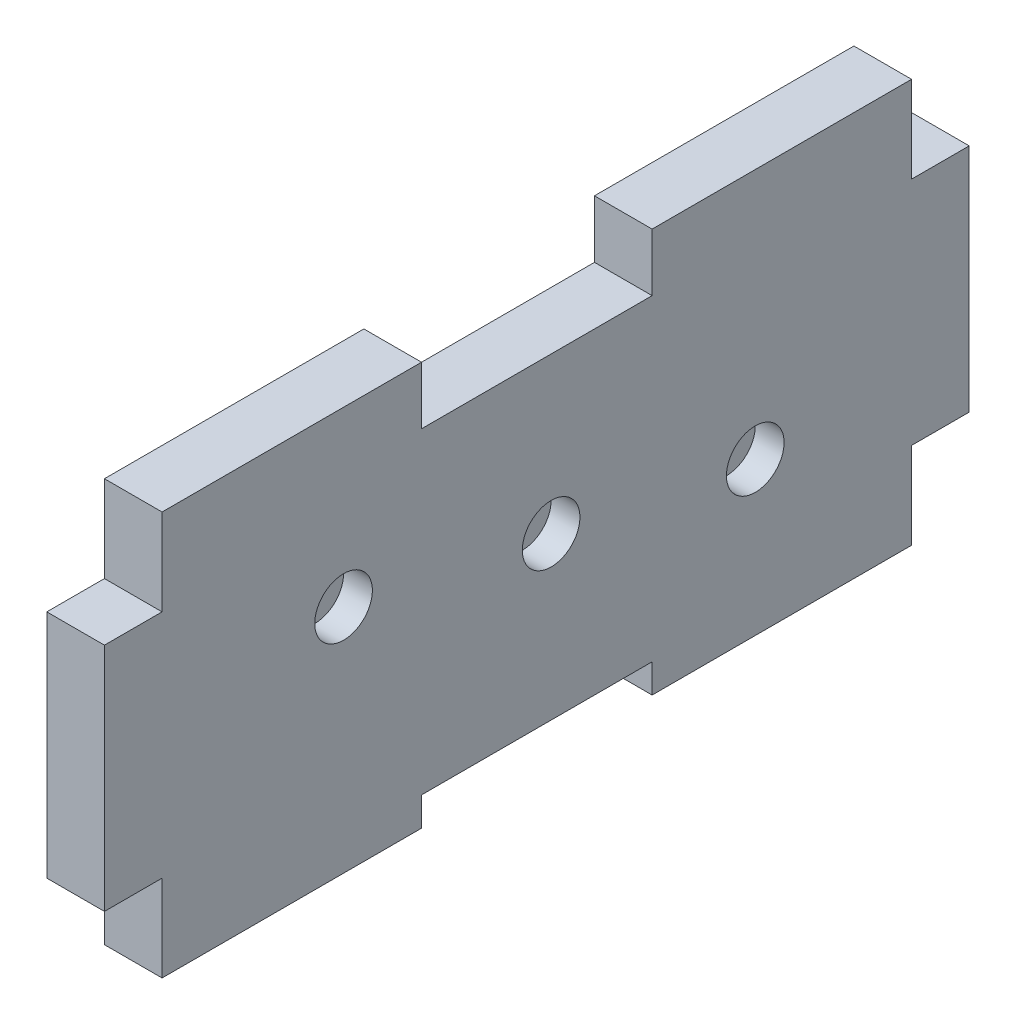
ISO-10303-21;
HEADER;
FILE_DESCRIPTION(('STEP AP214'),'2;1');
FILE_NAME('part.step','',(''),(''),'','','');
FILE_SCHEMA(('AUTOMOTIVE_DESIGN { 1 0 10303 214 1 1 1 1 }'));
ENDSEC;
DATA;
#1=APPLICATION_CONTEXT('core data for automotive mechanical design processes');
#2=APPLICATION_PROTOCOL_DEFINITION('international standard','automotive_design',2000,#1);
#3=PRODUCT_CONTEXT('',#1,'mechanical');
#4=PRODUCT('Part','Part','',(#3));
#5=PRODUCT_RELATED_PRODUCT_CATEGORY('part','',(#4));
#6=PRODUCT_DEFINITION_FORMATION('','',#4);
#7=PRODUCT_DEFINITION_CONTEXT('part definition',#1,'design');
#8=PRODUCT_DEFINITION('design','',#6,#7);
#9=PRODUCT_DEFINITION_SHAPE('','',#8);
#10=(LENGTH_UNIT() NAMED_UNIT(*) SI_UNIT(.MILLI.,.METRE.));
#11=(NAMED_UNIT(*) PLANE_ANGLE_UNIT() SI_UNIT($,.RADIAN.));
#12=(NAMED_UNIT(*) SI_UNIT($,.STERADIAN.) SOLID_ANGLE_UNIT());
#13=UNCERTAINTY_MEASURE_WITH_UNIT(LENGTH_MEASURE(1.E-05),#10,'distance_accuracy_value','');
#14=(GEOMETRIC_REPRESENTATION_CONTEXT(3) GLOBAL_UNCERTAINTY_ASSIGNED_CONTEXT((#13)) GLOBAL_UNIT_ASSIGNED_CONTEXT((#10,
#11,#12)) REPRESENTATION_CONTEXT('',''));
#15=CARTESIAN_POINT('',(0.,0.,0.));
#16=DIRECTION('',(0.,0.,1.));
#17=DIRECTION('',(1.,0.,0.));
#18=AXIS2_PLACEMENT_3D('',#15,#16,#17);
#19=CARTESIAN_POINT('',(5.,0.,55.));
#20=DIRECTION('',(0.,0.,1.));
#21=DIRECTION('',(1.,0.,0.));
#22=AXIS2_PLACEMENT_3D('',#19,#20,#21);
#23=PLANE('',#22);
#24=DIRECTION('',(-1.,0.,0.));
#25=VECTOR('',#24,1.);
#26=CARTESIAN_POINT('',(5.,5.00000000000001,55.));
#27=LINE('',#26,#25);
#28=CARTESIAN_POINT('',(5.,5.00000000000001,55.));
#29=VERTEX_POINT('',#28);
#30=CARTESIAN_POINT('',(-5.,5.00000000000001,55.));
#31=VERTEX_POINT('',#30);
#32=EDGE_CURVE('E180',#29,#31,#27,.T.);
#33=ORIENTED_EDGE('',*,*,#32,.T.);
#34=DIRECTION('',(0.,1.,0.));
#35=VECTOR('',#34,1.);
#36=CARTESIAN_POINT('',(-5.,0.,55.));
#37=LINE('',#36,#35);
#38=CARTESIAN_POINT('',(-5.,0.,55.));
#39=VERTEX_POINT('',#38);
#40=EDGE_CURVE('E179',#39,#31,#37,.T.);
#41=ORIENTED_EDGE('',*,*,#40,.F.);
#42=DIRECTION('',(-1.,0.,0.));
#43=VECTOR('',#42,1.);
#44=CARTESIAN_POINT('',(5.,0.,55.));
#45=LINE('',#44,#43);
#46=CARTESIAN_POINT('',(5.,0.,55.));
#47=VERTEX_POINT('',#46);
#48=EDGE_CURVE('E11',#47,#39,#45,.T.);
#49=ORIENTED_EDGE('',*,*,#48,.F.);
#50=DIRECTION('',(0.,1.,0.));
#51=VECTOR('',#50,1.);
#52=CARTESIAN_POINT('',(5.,0.,55.));
#53=LINE('',#52,#51);
#54=EDGE_CURVE('E254',#47,#29,#53,.T.);
#55=ORIENTED_EDGE('',*,*,#54,.T.);
#56=EDGE_LOOP('',(#33,#41,#49,#55));
#57=FACE_BOUND('',#56,.T.);
#58=ADVANCED_FACE('F35',(#57),#23,.T.);
#59=CARTESIAN_POINT('',(5.,0.,0.));
#60=DIRECTION('',(0.,1.,0.));
#61=DIRECTION('',(0.,0.,1.));
#62=AXIS2_PLACEMENT_3D('',#59,#60,#61);
#63=PLANE('',#62);
#64=ORIENTED_EDGE('',*,*,#48,.T.);
#65=DIRECTION('',(0.,0.,1.));
#66=VECTOR('',#65,1.);
#67=CARTESIAN_POINT('',(-5.,0.,10.));
#68=LINE('',#67,#66);
#69=CARTESIAN_POINT('',(-5.,0.,10.));
#70=VERTEX_POINT('',#69);
#71=EDGE_CURVE('E174',#70,#39,#68,.T.);
#72=ORIENTED_EDGE('',*,*,#71,.F.);
#73=DIRECTION('',(-1.,0.,0.));
#74=VECTOR('',#73,1.);
#75=CARTESIAN_POINT('',(5.,0.,10.));
#76=LINE('',#75,#74);
#77=CARTESIAN_POINT('',(5.,0.,10.));
#78=VERTEX_POINT('',#77);
#79=EDGE_CURVE('E42',#78,#70,#76,.T.);
#80=ORIENTED_EDGE('',*,*,#79,.F.);
#81=DIRECTION('',(0.,0.,-1.));
#82=VECTOR('',#81,1.);
#83=CARTESIAN_POINT('',(5.,0.,0.));
#84=LINE('',#83,#82);
#85=EDGE_CURVE('E175',#47,#78,#84,.T.);
#86=ORIENTED_EDGE('',*,*,#85,.F.);
#87=EDGE_LOOP('',(#64,#72,#80,#86));
#88=FACE_BOUND('',#87,.T.);
#89=ADVANCED_FACE('F171',(#88),#63,.F.);
#90=CARTESIAN_POINT('',(5.,0.,10.));
#91=DIRECTION('',(0.,0.,1.));
#92=DIRECTION('',(1.,0.,0.));
#93=AXIS2_PLACEMENT_3D('',#90,#91,#92);
#94=PLANE('',#93);
#95=ORIENTED_EDGE('',*,*,#79,.T.);
#96=DIRECTION('',(0.,-1.,0.));
#97=VECTOR('',#96,1.);
#98=CARTESIAN_POINT('',(-5.,15.,10.));
#99=LINE('',#98,#97);
#100=CARTESIAN_POINT('',(-5.,15.,10.));
#101=VERTEX_POINT('',#100);
#102=EDGE_CURVE('E190',#101,#70,#99,.T.);
#103=ORIENTED_EDGE('',*,*,#102,.F.);
#104=DIRECTION('',(-1.,0.,0.));
#105=VECTOR('',#104,1.);
#106=CARTESIAN_POINT('',(5.,15.,10.));
#107=LINE('',#106,#105);
#108=CARTESIAN_POINT('',(5.,15.,10.));
#109=VERTEX_POINT('',#108);
#110=EDGE_CURVE('E336',#109,#101,#107,.T.);
#111=ORIENTED_EDGE('',*,*,#110,.F.);
#112=DIRECTION('',(0.,1.,0.));
#113=VECTOR('',#112,1.);
#114=CARTESIAN_POINT('',(5.,0.,10.));
#115=LINE('',#114,#113);
#116=EDGE_CURVE('E263',#78,#109,#115,.T.);
#117=ORIENTED_EDGE('',*,*,#116,.F.);
#118=EDGE_LOOP('',(#95,#103,#111,#117));
#119=FACE_BOUND('',#118,.T.);
#120=ADVANCED_FACE('F339',(#119),#94,.F.);
#121=CARTESIAN_POINT('',(5.,15.,0.));
#122=DIRECTION('',(0.,-1.,0.));
#123=DIRECTION('',(0.,0.,-1.));
#124=AXIS2_PLACEMENT_3D('',#121,#122,#123);
#125=PLANE('',#124);
#126=ORIENTED_EDGE('',*,*,#110,.T.);
#127=DIRECTION('',(0.,0.,1.));
#128=VECTOR('',#127,1.);
#129=CARTESIAN_POINT('',(-5.,15.,0.));
#130=LINE('',#129,#128);
#131=CARTESIAN_POINT('',(-5.,15.,0.));
#132=VERTEX_POINT('',#131);
#133=EDGE_CURVE('E239',#132,#101,#130,.T.);
#134=ORIENTED_EDGE('',*,*,#133,.F.);
#135=DIRECTION('',(-1.,0.,0.));
#136=VECTOR('',#135,1.);
#137=CARTESIAN_POINT('',(5.,15.,0.));
#138=LINE('',#137,#136);
#139=CARTESIAN_POINT('',(5.,15.,0.));
#140=VERTEX_POINT('',#139);
#141=EDGE_CURVE('E334',#140,#132,#138,.T.);
#142=ORIENTED_EDGE('',*,*,#141,.F.);
#143=DIRECTION('',(0.,0.,1.));
#144=VECTOR('',#143,1.);
#145=CARTESIAN_POINT('',(5.,15.,0.));
#146=LINE('',#145,#144);
#147=EDGE_CURVE('E266',#140,#109,#146,.T.);
#148=ORIENTED_EDGE('',*,*,#147,.T.);
#149=EDGE_LOOP('',(#126,#134,#142,#148));
#150=FACE_BOUND('',#149,.T.);
#151=ADVANCED_FACE('F427',(#150),#125,.T.);
#152=CARTESIAN_POINT('',(5.,0.,0.));
#153=DIRECTION('',(0.,0.,-1.));
#154=DIRECTION('',(0.,1.,0.));
#155=AXIS2_PLACEMENT_3D('',#152,#153,#154);
#156=PLANE('',#155);
#157=ORIENTED_EDGE('',*,*,#141,.T.);
#158=DIRECTION('',(0.,-1.,0.));
#159=VECTOR('',#158,1.);
#160=CARTESIAN_POINT('',(-5.,55.,0.));
#161=LINE('',#160,#159);
#162=CARTESIAN_POINT('',(-5.,55.,0.));
#163=VERTEX_POINT('',#162);
#164=EDGE_CURVE('E236',#163,#132,#161,.T.);
#165=ORIENTED_EDGE('',*,*,#164,.F.);
#166=DIRECTION('',(-1.,0.,0.));
#167=VECTOR('',#166,1.);
#168=CARTESIAN_POINT('',(5.,55.,0.));
#169=LINE('',#168,#167);
#170=CARTESIAN_POINT('',(5.,55.,0.));
#171=VERTEX_POINT('',#170);
#172=EDGE_CURVE('E332',#171,#163,#169,.T.);
#173=ORIENTED_EDGE('',*,*,#172,.F.);
#174=DIRECTION('',(0.,-1.,0.));
#175=VECTOR('',#174,1.);
#176=CARTESIAN_POINT('',(5.,0.,0.));
#177=LINE('',#176,#175);
#178=EDGE_CURVE('E269',#171,#140,#177,.T.);
#179=ORIENTED_EDGE('',*,*,#178,.T.);
#180=EDGE_LOOP('',(#157,#165,#173,#179));
#181=FACE_BOUND('',#180,.T.);
#182=ADVANCED_FACE('F346',(#181),#156,.T.);
#183=CARTESIAN_POINT('',(5.,55.,0.));
#184=DIRECTION('',(0.,-1.,0.));
#185=DIRECTION('',(0.,0.,-1.));
#186=AXIS2_PLACEMENT_3D('',#183,#184,#185);
#187=PLANE('',#186);
#188=ORIENTED_EDGE('',*,*,#172,.T.);
#189=DIRECTION('',(0.,0.,-1.));
#190=VECTOR('',#189,1.);
#191=CARTESIAN_POINT('',(-5.,55.,10.));
#192=LINE('',#191,#190);
#193=CARTESIAN_POINT('',(-5.,55.,10.));
#194=VERTEX_POINT('',#193);
#195=EDGE_CURVE('E233',#194,#163,#192,.T.);
#196=ORIENTED_EDGE('',*,*,#195,.F.);
#197=DIRECTION('',(-1.,0.,0.));
#198=VECTOR('',#197,1.);
#199=CARTESIAN_POINT('',(5.,55.,10.));
#200=LINE('',#199,#198);
#201=CARTESIAN_POINT('',(5.,55.,10.));
#202=VERTEX_POINT('',#201);
#203=EDGE_CURVE('E330',#202,#194,#200,.T.);
#204=ORIENTED_EDGE('',*,*,#203,.F.);
#205=DIRECTION('',(0.,0.,1.));
#206=VECTOR('',#205,1.);
#207=CARTESIAN_POINT('',(5.,55.,0.));
#208=LINE('',#207,#206);
#209=EDGE_CURVE('E272',#171,#202,#208,.T.);
#210=ORIENTED_EDGE('',*,*,#209,.F.);
#211=EDGE_LOOP('',(#188,#196,#204,#210));
#212=FACE_BOUND('',#211,.T.);
#213=ADVANCED_FACE('F352',(#212),#187,.F.);
#214=CARTESIAN_POINT('',(5.,0.,9.99999999999999));
#215=DIRECTION('',(0.,0.,-1.));
#216=DIRECTION('',(0.,1.,0.));
#217=AXIS2_PLACEMENT_3D('',#214,#215,#216);
#218=PLANE('',#217);
#219=ORIENTED_EDGE('',*,*,#203,.T.);
#220=DIRECTION('',(0.,-1.,0.));
#221=VECTOR('',#220,1.);
#222=CARTESIAN_POINT('',(-5.,70.,10.));
#223=LINE('',#222,#221);
#224=CARTESIAN_POINT('',(-5.,70.,10.));
#225=VERTEX_POINT('',#224);
#226=EDGE_CURVE('E230',#225,#194,#223,.T.);
#227=ORIENTED_EDGE('',*,*,#226,.F.);
#228=DIRECTION('',(-1.,0.,0.));
#229=VECTOR('',#228,1.);
#230=CARTESIAN_POINT('',(5.,70.,10.));
#231=LINE('',#230,#229);
#232=CARTESIAN_POINT('',(5.,70.,10.));
#233=VERTEX_POINT('',#232);
#234=EDGE_CURVE('E328',#233,#225,#231,.T.);
#235=ORIENTED_EDGE('',*,*,#234,.F.);
#236=DIRECTION('',(0.,-1.,0.));
#237=VECTOR('',#236,1.);
#238=CARTESIAN_POINT('',(5.,0.,9.99999999999999));
#239=LINE('',#238,#237);
#240=EDGE_CURVE('E274',#233,#202,#239,.T.);
#241=ORIENTED_EDGE('',*,*,#240,.T.);
#242=EDGE_LOOP('',(#219,#227,#235,#241));
#243=FACE_BOUND('',#242,.T.);
#244=ADVANCED_FACE('F453',(#243),#218,.T.);
#245=CARTESIAN_POINT('',(5.,70.,0.));
#246=DIRECTION('',(0.,1.,0.));
#247=DIRECTION('',(0.,0.,1.));
#248=AXIS2_PLACEMENT_3D('',#245,#246,#247);
#249=PLANE('',#248);
#250=ORIENTED_EDGE('',*,*,#234,.T.);
#251=DIRECTION('',(0.,0.,-1.));
#252=VECTOR('',#251,1.);
#253=CARTESIAN_POINT('',(-5.,70.,55.));
#254=LINE('',#253,#252);
#255=CARTESIAN_POINT('',(-5.,70.,55.));
#256=VERTEX_POINT('',#255);
#257=EDGE_CURVE('E227',#256,#225,#254,.T.);
#258=ORIENTED_EDGE('',*,*,#257,.F.);
#259=DIRECTION('',(-1.,0.,0.));
#260=VECTOR('',#259,1.);
#261=CARTESIAN_POINT('',(5.,70.,55.));
#262=LINE('',#261,#260);
#263=CARTESIAN_POINT('',(5.,70.,55.));
#264=VERTEX_POINT('',#263);
#265=EDGE_CURVE('E326',#264,#256,#262,.T.);
#266=ORIENTED_EDGE('',*,*,#265,.F.);
#267=DIRECTION('',(0.,0.,-1.));
#268=VECTOR('',#267,1.);
#269=CARTESIAN_POINT('',(5.,70.,0.));
#270=LINE('',#269,#268);
#271=EDGE_CURVE('E277',#264,#233,#270,.T.);
#272=ORIENTED_EDGE('',*,*,#271,.T.);
#273=EDGE_LOOP('',(#250,#258,#266,#272));
#274=FACE_BOUND('',#273,.T.);
#275=ADVANCED_FACE('F357',(#274),#249,.T.);
#276=CARTESIAN_POINT('',(5.,0.,55.));
#277=DIRECTION('',(0.,0.,-1.));
#278=DIRECTION('',(-1.,0.,0.));
#279=AXIS2_PLACEMENT_3D('',#276,#277,#278);
#280=PLANE('',#279);
#281=ORIENTED_EDGE('',*,*,#265,.T.);
#282=DIRECTION('',(0.,1.,0.));
#283=VECTOR('',#282,1.);
#284=CARTESIAN_POINT('',(-5.,60.,55.));
#285=LINE('',#284,#283);
#286=CARTESIAN_POINT('',(-5.,60.,55.));
#287=VERTEX_POINT('',#286);
#288=EDGE_CURVE('E224',#287,#256,#285,.T.);
#289=ORIENTED_EDGE('',*,*,#288,.F.);
#290=DIRECTION('',(-1.,0.,0.));
#291=VECTOR('',#290,1.);
#292=CARTESIAN_POINT('',(5.,60.,55.));
#293=LINE('',#292,#291);
#294=CARTESIAN_POINT('',(5.,60.,55.));
#295=VERTEX_POINT('',#294);
#296=EDGE_CURVE('E324',#295,#287,#293,.T.);
#297=ORIENTED_EDGE('',*,*,#296,.F.);
#298=DIRECTION('',(0.,-1.,0.));
#299=VECTOR('',#298,1.);
#300=CARTESIAN_POINT('',(5.,0.,55.));
#301=LINE('',#300,#299);
#302=EDGE_CURVE('E280',#264,#295,#301,.T.);
#303=ORIENTED_EDGE('',*,*,#302,.F.);
#304=EDGE_LOOP('',(#281,#289,#297,#303));
#305=FACE_BOUND('',#304,.T.);
#306=ADVANCED_FACE('F363',(#305),#280,.F.);
#307=CARTESIAN_POINT('',(5.,60.,0.));
#308=DIRECTION('',(0.,1.,0.));
#309=DIRECTION('',(0.,0.,1.));
#310=AXIS2_PLACEMENT_3D('',#307,#308,#309);
#311=PLANE('',#310);
#312=ORIENTED_EDGE('',*,*,#296,.T.);
#313=DIRECTION('',(0.,0.,-1.));
#314=VECTOR('',#313,1.);
#315=CARTESIAN_POINT('',(-5.,60.,95.));
#316=LINE('',#315,#314);
#317=CARTESIAN_POINT('',(-5.,60.,95.));
#318=VERTEX_POINT('',#317);
#319=EDGE_CURVE('E221',#318,#287,#316,.T.);
#320=ORIENTED_EDGE('',*,*,#319,.F.);
#321=DIRECTION('',(-1.,0.,0.));
#322=VECTOR('',#321,1.);
#323=CARTESIAN_POINT('',(5.,60.,95.));
#324=LINE('',#323,#322);
#325=CARTESIAN_POINT('',(5.,60.,95.));
#326=VERTEX_POINT('',#325);
#327=EDGE_CURVE('E322',#326,#318,#324,.T.);
#328=ORIENTED_EDGE('',*,*,#327,.F.);
#329=DIRECTION('',(0.,0.,-1.));
#330=VECTOR('',#329,1.);
#331=CARTESIAN_POINT('',(5.,60.,0.));
#332=LINE('',#331,#330);
#333=EDGE_CURVE('E283',#326,#295,#332,.T.);
#334=ORIENTED_EDGE('',*,*,#333,.T.);
#335=EDGE_LOOP('',(#312,#320,#328,#334));
#336=FACE_BOUND('',#335,.T.);
#337=ADVANCED_FACE('F448',(#336),#311,.T.);
#338=CARTESIAN_POINT('',(5.,0.,95.));
#339=DIRECTION('',(0.,0.,-1.));
#340=DIRECTION('',(-1.,0.,0.));
#341=AXIS2_PLACEMENT_3D('',#338,#339,#340);
#342=PLANE('',#341);
#343=ORIENTED_EDGE('',*,*,#327,.T.);
#344=DIRECTION('',(0.,-1.,0.));
#345=VECTOR('',#344,1.);
#346=CARTESIAN_POINT('',(-5.,70.,95.));
#347=LINE('',#346,#345);
#348=CARTESIAN_POINT('',(-5.,70.,95.));
#349=VERTEX_POINT('',#348);
#350=EDGE_CURVE('E218',#349,#318,#347,.T.);
#351=ORIENTED_EDGE('',*,*,#350,.F.);
#352=DIRECTION('',(-1.,0.,0.));
#353=VECTOR('',#352,1.);
#354=CARTESIAN_POINT('',(5.,70.,95.));
#355=LINE('',#354,#353);
#356=CARTESIAN_POINT('',(5.,70.,95.));
#357=VERTEX_POINT('',#356);
#358=EDGE_CURVE('E320',#357,#349,#355,.T.);
#359=ORIENTED_EDGE('',*,*,#358,.F.);
#360=DIRECTION('',(0.,-1.,0.));
#361=VECTOR('',#360,1.);
#362=CARTESIAN_POINT('',(5.,0.,95.));
#363=LINE('',#362,#361);
#364=EDGE_CURVE('E286',#357,#326,#363,.T.);
#365=ORIENTED_EDGE('',*,*,#364,.T.);
#366=EDGE_LOOP('',(#343,#351,#359,#365));
#367=FACE_BOUND('',#366,.T.);
#368=ADVANCED_FACE('F370',(#367),#342,.T.);
#369=ORIENTED_EDGE('',*,*,#358,.T.);
#370=DIRECTION('',(0.,0.,-1.));
#371=VECTOR('',#370,1.);
#372=CARTESIAN_POINT('',(-5.,70.,140.));
#373=LINE('',#372,#371);
#374=CARTESIAN_POINT('',(-5.,70.,140.));
#375=VERTEX_POINT('',#374);
#376=EDGE_CURVE('E215',#375,#349,#373,.T.);
#377=ORIENTED_EDGE('',*,*,#376,.F.);
#378=DIRECTION('',(-1.,0.,0.));
#379=VECTOR('',#378,1.);
#380=CARTESIAN_POINT('',(5.,70.,140.));
#381=LINE('',#380,#379);
#382=CARTESIAN_POINT('',(5.,70.,140.));
#383=VERTEX_POINT('',#382);
#384=EDGE_CURVE('E318',#383,#375,#381,.T.);
#385=ORIENTED_EDGE('',*,*,#384,.F.);
#386=EDGE_CURVE('E281',#383,#357,#270,.T.);
#387=ORIENTED_EDGE('',*,*,#386,.T.);
#388=EDGE_LOOP('',(#369,#377,#385,#387));
#389=FACE_BOUND('',#388,.T.);
#390=ADVANCED_FACE('F374',(#389),#249,.T.);
#391=CARTESIAN_POINT('',(5.,0.,140.));
#392=DIRECTION('',(0.,0.,-1.));
#393=DIRECTION('',(-1.,0.,0.));
#394=AXIS2_PLACEMENT_3D('',#391,#392,#393);
#395=PLANE('',#394);
#396=ORIENTED_EDGE('',*,*,#384,.T.);
#397=DIRECTION('',(0.,1.,0.));
#398=VECTOR('',#397,1.);
#399=CARTESIAN_POINT('',(-5.,55.,140.));
#400=LINE('',#399,#398);
#401=CARTESIAN_POINT('',(-5.,55.,140.));
#402=VERTEX_POINT('',#401);
#403=EDGE_CURVE('E212',#402,#375,#400,.T.);
#404=ORIENTED_EDGE('',*,*,#403,.F.);
#405=DIRECTION('',(-1.,0.,0.));
#406=VECTOR('',#405,1.);
#407=CARTESIAN_POINT('',(5.,55.,140.));
#408=LINE('',#407,#406);
#409=CARTESIAN_POINT('',(5.,55.,140.));
#410=VERTEX_POINT('',#409);
#411=EDGE_CURVE('E316',#410,#402,#408,.T.);
#412=ORIENTED_EDGE('',*,*,#411,.F.);
#413=DIRECTION('',(0.,-1.,0.));
#414=VECTOR('',#413,1.);
#415=CARTESIAN_POINT('',(5.,0.,140.));
#416=LINE('',#415,#414);
#417=EDGE_CURVE('E289',#383,#410,#416,.T.);
#418=ORIENTED_EDGE('',*,*,#417,.F.);
#419=EDGE_LOOP('',(#396,#404,#412,#418));
#420=FACE_BOUND('',#419,.T.);
#421=ADVANCED_FACE('F380',(#420),#395,.F.);
#422=CARTESIAN_POINT('',(5.,55.,0.));
#423=DIRECTION('',(0.,1.,0.));
#424=DIRECTION('',(0.,0.,1.));
#425=AXIS2_PLACEMENT_3D('',#422,#423,#424);
#426=PLANE('',#425);
#427=ORIENTED_EDGE('',*,*,#411,.T.);
#428=DIRECTION('',(0.,0.,-1.));
#429=VECTOR('',#428,1.);
#430=CARTESIAN_POINT('',(-5.,55.,150.));
#431=LINE('',#430,#429);
#432=CARTESIAN_POINT('',(-5.,55.,150.));
#433=VERTEX_POINT('',#432);
#434=EDGE_CURVE('E209',#433,#402,#431,.T.);
#435=ORIENTED_EDGE('',*,*,#434,.F.);
#436=DIRECTION('',(-1.,0.,0.));
#437=VECTOR('',#436,1.);
#438=CARTESIAN_POINT('',(5.,55.,150.));
#439=LINE('',#438,#437);
#440=CARTESIAN_POINT('',(5.,55.,150.));
#441=VERTEX_POINT('',#440);
#442=EDGE_CURVE('E314',#441,#433,#439,.T.);
#443=ORIENTED_EDGE('',*,*,#442,.F.);
#444=DIRECTION('',(0.,0.,-1.));
#445=VECTOR('',#444,1.);
#446=CARTESIAN_POINT('',(5.,55.,0.));
#447=LINE('',#446,#445);
#448=EDGE_CURVE('E291',#441,#410,#447,.T.);
#449=ORIENTED_EDGE('',*,*,#448,.T.);
#450=EDGE_LOOP('',(#427,#435,#443,#449));
#451=FACE_BOUND('',#450,.T.);
#452=ADVANCED_FACE('F386',(#451),#426,.T.);
#453=CARTESIAN_POINT('',(5.,0.,150.));
#454=DIRECTION('',(0.,0.,-1.));
#455=DIRECTION('',(0.,1.,0.));
#456=AXIS2_PLACEMENT_3D('',#453,#454,#455);
#457=PLANE('',#456);
#458=ORIENTED_EDGE('',*,*,#442,.T.);
#459=DIRECTION('',(0.,1.,0.));
#460=VECTOR('',#459,1.);
#461=CARTESIAN_POINT('',(-5.,15.,150.));
#462=LINE('',#461,#460);
#463=CARTESIAN_POINT('',(-5.,15.,150.));
#464=VERTEX_POINT('',#463);
#465=EDGE_CURVE('E206',#464,#433,#462,.T.);
#466=ORIENTED_EDGE('',*,*,#465,.F.);
#467=DIRECTION('',(-1.,0.,0.));
#468=VECTOR('',#467,1.);
#469=CARTESIAN_POINT('',(5.,15.,150.));
#470=LINE('',#469,#468);
#471=CARTESIAN_POINT('',(5.,15.,150.));
#472=VERTEX_POINT('',#471);
#473=EDGE_CURVE('E312',#472,#464,#470,.T.);
#474=ORIENTED_EDGE('',*,*,#473,.F.);
#475=DIRECTION('',(0.,-1.,0.));
#476=VECTOR('',#475,1.);
#477=CARTESIAN_POINT('',(5.,0.,150.));
#478=LINE('',#477,#476);
#479=EDGE_CURVE('E294',#441,#472,#478,.T.);
#480=ORIENTED_EDGE('',*,*,#479,.F.);
#481=EDGE_LOOP('',(#458,#466,#474,#480));
#482=FACE_BOUND('',#481,.T.);
#483=ADVANCED_FACE('F389',(#482),#457,.F.);
#484=CARTESIAN_POINT('',(5.,15.,0.));
#485=DIRECTION('',(0.,1.,0.));
#486=DIRECTION('',(0.,0.,1.));
#487=AXIS2_PLACEMENT_3D('',#484,#485,#486);
#488=PLANE('',#487);
#489=ORIENTED_EDGE('',*,*,#473,.T.);
#490=DIRECTION('',(0.,0.,1.));
#491=VECTOR('',#490,1.);
#492=CARTESIAN_POINT('',(-5.,15.,140.));
#493=LINE('',#492,#491);
#494=CARTESIAN_POINT('',(-5.,15.,140.));
#495=VERTEX_POINT('',#494);
#496=EDGE_CURVE('E203',#495,#464,#493,.T.);
#497=ORIENTED_EDGE('',*,*,#496,.F.);
#498=DIRECTION('',(-1.,0.,0.));
#499=VECTOR('',#498,1.);
#500=CARTESIAN_POINT('',(5.,15.,140.));
#501=LINE('',#500,#499);
#502=CARTESIAN_POINT('',(5.,15.,140.));
#503=VERTEX_POINT('',#502);
#504=EDGE_CURVE('E310',#503,#495,#501,.T.);
#505=ORIENTED_EDGE('',*,*,#504,.F.);
#506=DIRECTION('',(0.,0.,-1.));
#507=VECTOR('',#506,1.);
#508=CARTESIAN_POINT('',(5.,15.,0.));
#509=LINE('',#508,#507);
#510=EDGE_CURVE('E296',#472,#503,#509,.T.);
#511=ORIENTED_EDGE('',*,*,#510,.F.);
#512=EDGE_LOOP('',(#489,#497,#505,#511));
#513=FACE_BOUND('',#512,.T.);
#514=ADVANCED_FACE('F394',(#513),#488,.F.);
#515=CARTESIAN_POINT('',(5.,0.,140.));
#516=DIRECTION('',(0.,0.,1.));
#517=DIRECTION('',(1.,0.,0.));
#518=AXIS2_PLACEMENT_3D('',#515,#516,#517);
#519=PLANE('',#518);
#520=ORIENTED_EDGE('',*,*,#504,.T.);
#521=DIRECTION('',(0.,1.,0.));
#522=VECTOR('',#521,1.);
#523=CARTESIAN_POINT('',(-5.,0.,140.));
#524=LINE('',#523,#522);
#525=CARTESIAN_POINT('',(-5.,0.,140.));
#526=VERTEX_POINT('',#525);
#527=EDGE_CURVE('E200',#526,#495,#524,.T.);
#528=ORIENTED_EDGE('',*,*,#527,.F.);
#529=DIRECTION('',(-1.,0.,0.));
#530=VECTOR('',#529,1.);
#531=CARTESIAN_POINT('',(5.,0.,140.));
#532=LINE('',#531,#530);
#533=CARTESIAN_POINT('',(5.,0.,140.));
#534=VERTEX_POINT('',#533);
#535=EDGE_CURVE('E308',#534,#526,#532,.T.);
#536=ORIENTED_EDGE('',*,*,#535,.F.);
#537=DIRECTION('',(0.,1.,0.));
#538=VECTOR('',#537,1.);
#539=CARTESIAN_POINT('',(5.,0.,140.));
#540=LINE('',#539,#538);
#541=EDGE_CURVE('E298',#534,#503,#540,.T.);
#542=ORIENTED_EDGE('',*,*,#541,.T.);
#543=EDGE_LOOP('',(#520,#528,#536,#542));
#544=FACE_BOUND('',#543,.T.);
#545=ADVANCED_FACE('F399',(#544),#519,.T.);
#546=ORIENTED_EDGE('',*,*,#535,.T.);
#547=DIRECTION('',(0.,0.,1.));
#548=VECTOR('',#547,1.);
#549=CARTESIAN_POINT('',(-5.,0.,95.));
#550=LINE('',#549,#548);
#551=CARTESIAN_POINT('',(-5.,0.,95.));
#552=VERTEX_POINT('',#551);
#553=EDGE_CURVE('E197',#552,#526,#550,.T.);
#554=ORIENTED_EDGE('',*,*,#553,.F.);
#555=DIRECTION('',(-1.,0.,0.));
#556=VECTOR('',#555,1.);
#557=CARTESIAN_POINT('',(5.,0.,95.));
#558=LINE('',#557,#556);
#559=CARTESIAN_POINT('',(5.,0.,95.));
#560=VERTEX_POINT('',#559);
#561=EDGE_CURVE('E306',#560,#552,#558,.T.);
#562=ORIENTED_EDGE('',*,*,#561,.F.);
#563=EDGE_CURVE('E264',#534,#560,#84,.T.);
#564=ORIENTED_EDGE('',*,*,#563,.F.);
#565=EDGE_LOOP('',(#546,#554,#562,#564));
#566=FACE_BOUND('',#565,.T.);
#567=ADVANCED_FACE('F403',(#566),#63,.F.);
#568=CARTESIAN_POINT('',(5.,0.,95.));
#569=DIRECTION('',(0.,0.,1.));
#570=DIRECTION('',(1.,0.,0.));
#571=AXIS2_PLACEMENT_3D('',#568,#569,#570);
#572=PLANE('',#571);
#573=ORIENTED_EDGE('',*,*,#561,.T.);
#574=DIRECTION('',(0.,-1.,0.));
#575=VECTOR('',#574,1.);
#576=CARTESIAN_POINT('',(-5.,5.00000000000001,95.));
#577=LINE('',#576,#575);
#578=CARTESIAN_POINT('',(-5.,5.00000000000001,95.));
#579=VERTEX_POINT('',#578);
#580=EDGE_CURVE('E194',#579,#552,#577,.T.);
#581=ORIENTED_EDGE('',*,*,#580,.F.);
#582=DIRECTION('',(-1.,0.,0.));
#583=VECTOR('',#582,1.);
#584=CARTESIAN_POINT('',(5.,5.00000000000001,95.));
#585=LINE('',#584,#583);
#586=CARTESIAN_POINT('',(5.,5.00000000000001,95.));
#587=VERTEX_POINT('',#586);
#588=EDGE_CURVE('E304',#587,#579,#585,.T.);
#589=ORIENTED_EDGE('',*,*,#588,.F.);
#590=DIRECTION('',(0.,1.,0.));
#591=VECTOR('',#590,1.);
#592=CARTESIAN_POINT('',(5.,0.,95.));
#593=LINE('',#592,#591);
#594=EDGE_CURVE('E54',#560,#587,#593,.T.);
#595=ORIENTED_EDGE('',*,*,#594,.F.);
#596=EDGE_LOOP('',(#573,#581,#589,#595));
#597=FACE_BOUND('',#596,.T.);
#598=ADVANCED_FACE('F406',(#597),#572,.F.);
#599=CARTESIAN_POINT('',(5.,5.00000000000001,0.));
#600=DIRECTION('',(0.,1.,0.));
#601=DIRECTION('',(0.,0.,1.));
#602=AXIS2_PLACEMENT_3D('',#599,#600,#601);
#603=PLANE('',#602);
#604=ORIENTED_EDGE('',*,*,#588,.T.);
#605=DIRECTION('',(0.,0.,1.));
#606=VECTOR('',#605,1.);
#607=CARTESIAN_POINT('',(-5.,5.00000000000001,55.));
#608=LINE('',#607,#606);
#609=EDGE_CURVE('E184',#31,#579,#608,.T.);
#610=ORIENTED_EDGE('',*,*,#609,.F.);
#611=ORIENTED_EDGE('',*,*,#32,.F.);
#612=DIRECTION('',(0.,0.,-1.));
#613=VECTOR('',#612,1.);
#614=CARTESIAN_POINT('',(5.,5.00000000000001,0.));
#615=LINE('',#614,#613);
#616=EDGE_CURVE('E49',#587,#29,#615,.T.);
#617=ORIENTED_EDGE('',*,*,#616,.F.);
#618=EDGE_LOOP('',(#604,#610,#611,#617));
#619=FACE_BOUND('',#618,.T.);
#620=ADVANCED_FACE('F408',(#619),#603,.F.);
#621=CARTESIAN_POINT('',(5.,0.,0.));
#622=DIRECTION('',(1.,0.,0.));
#623=DIRECTION('',(0.,0.,-1.));
#624=AXIS2_PLACEMENT_3D('',#621,#622,#623);
#625=PLANE('',#624);
#626=CARTESIAN_POINT('',(5.,40.,108.52));
#627=DIRECTION('',(1.,0.,0.));
#628=DIRECTION('',(0.,0.,-1.));
#629=AXIS2_PLACEMENT_3D('',#626,#627,#628);
#630=CIRCLE('',#629,5.00000000000001);
#631=CARTESIAN_POINT('',(5.,40.,103.52));
#632=VERTEX_POINT('',#631);
#633=EDGE_CURVE('E247',#632,#632,#630,.T.);
#634=ORIENTED_EDGE('',*,*,#633,.F.);
#635=EDGE_LOOP('',(#634));
#636=FACE_BOUND('',#635,.T.);
#637=CARTESIAN_POINT('',(5.,26.5,37.1116676472896));
#638=DIRECTION('',(-1.,0.,0.));
#639=DIRECTION('',(0.,0.,1.));
#640=AXIS2_PLACEMENT_3D('',#637,#638,#639);
#641=CIRCLE('',#640,4.99999999999999);
#642=CARTESIAN_POINT('',(5.,26.5,42.1116676472896));
#643=VERTEX_POINT('',#642);
#644=EDGE_CURVE('E251',#643,#643,#641,.T.);
#645=ORIENTED_EDGE('',*,*,#644,.T.);
#646=EDGE_LOOP('',(#645));
#647=FACE_BOUND('',#646,.T.);
#648=CARTESIAN_POINT('',(5.,33.,72.52));
#649=DIRECTION('',(-1.,0.,0.));
#650=DIRECTION('',(0.,0.,1.));
#651=AXIS2_PLACEMENT_3D('',#648,#649,#650);
#652=CIRCLE('',#651,4.99999999999999);
#653=CARTESIAN_POINT('',(5.,33.,77.52));
#654=VERTEX_POINT('',#653);
#655=EDGE_CURVE('E246',#654,#654,#652,.T.);
#656=ORIENTED_EDGE('',*,*,#655,.T.);
#657=EDGE_LOOP('',(#656));
#658=FACE_BOUND('',#657,.T.);
#659=ORIENTED_EDGE('',*,*,#54,.F.);
#660=ORIENTED_EDGE('',*,*,#85,.T.);
#661=ORIENTED_EDGE('',*,*,#116,.T.);
#662=ORIENTED_EDGE('',*,*,#147,.F.);
#663=ORIENTED_EDGE('',*,*,#178,.F.);
#664=ORIENTED_EDGE('',*,*,#209,.T.);
#665=ORIENTED_EDGE('',*,*,#240,.F.);
#666=ORIENTED_EDGE('',*,*,#271,.F.);
#667=ORIENTED_EDGE('',*,*,#302,.T.);
#668=ORIENTED_EDGE('',*,*,#333,.F.);
#669=ORIENTED_EDGE('',*,*,#364,.F.);
#670=ORIENTED_EDGE('',*,*,#386,.F.);
#671=ORIENTED_EDGE('',*,*,#417,.T.);
#672=ORIENTED_EDGE('',*,*,#448,.F.);
#673=ORIENTED_EDGE('',*,*,#479,.T.);
#674=ORIENTED_EDGE('',*,*,#510,.T.);
#675=ORIENTED_EDGE('',*,*,#541,.F.);
#676=ORIENTED_EDGE('',*,*,#563,.T.);
#677=ORIENTED_EDGE('',*,*,#594,.T.);
#678=ORIENTED_EDGE('',*,*,#616,.T.);
#679=EDGE_LOOP('',(#659,#660,#661,#662,#663,#664,#665,#666,#667,#668,#669,#670,#671,#672,#673,
#674,#675,#676,#677,#678));
#680=FACE_BOUND('',#679,.T.);
#681=ADVANCED_FACE('F342',(#636,#647,#658,#680),#625,.T.);
#682=CARTESIAN_POINT('',(5.,33.,72.52));
#683=DIRECTION('',(-1.,0.,0.));
#684=DIRECTION('',(0.,0.,1.));
#685=AXIS2_PLACEMENT_3D('',#682,#683,#684);
#686=CYLINDRICAL_SURFACE('',#685,4.99999999999999);
#687=ORIENTED_EDGE('',*,*,#655,.F.);
#688=EDGE_LOOP('',(#687));
#689=FACE_BOUND('',#688,.T.);
#690=CARTESIAN_POINT('',(0.,33.,72.52));
#691=DIRECTION('',(-1.,0.,0.));
#692=DIRECTION('',(0.,0.,1.));
#693=AXIS2_PLACEMENT_3D('',#690,#691,#692);
#694=CIRCLE('',#693,4.99999999999999);
#695=CARTESIAN_POINT('',(0.,33.,77.52));
#696=VERTEX_POINT('',#695);
#697=EDGE_CURVE('E242',#696,#696,#694,.T.);
#698=ORIENTED_EDGE('',*,*,#697,.T.);
#699=EDGE_LOOP('',(#698));
#700=FACE_BOUND('',#699,.T.);
#701=ADVANCED_FACE('F415',(#689,#700),#686,.F.);
#702=CARTESIAN_POINT('',(5.,26.5,37.1116676472896));
#703=DIRECTION('',(-1.,0.,0.));
#704=DIRECTION('',(0.,0.,1.));
#705=AXIS2_PLACEMENT_3D('',#702,#703,#704);
#706=CYLINDRICAL_SURFACE('',#705,4.99999999999999);
#707=ORIENTED_EDGE('',*,*,#644,.F.);
#708=EDGE_LOOP('',(#707));
#709=FACE_BOUND('',#708,.T.);
#710=CARTESIAN_POINT('',(0.,26.5,37.1116676472896));
#711=DIRECTION('',(-1.,0.,0.));
#712=DIRECTION('',(0.,0.,1.));
#713=AXIS2_PLACEMENT_3D('',#710,#711,#712);
#714=CIRCLE('',#713,4.99999999999999);
#715=CARTESIAN_POINT('',(0.,26.5,42.1116676472896));
#716=VERTEX_POINT('',#715);
#717=EDGE_CURVE('E250',#716,#716,#714,.T.);
#718=ORIENTED_EDGE('',*,*,#717,.T.);
#719=EDGE_LOOP('',(#718));
#720=FACE_BOUND('',#719,.T.);
#721=ADVANCED_FACE('F583',(#709,#720),#706,.F.);
#722=CARTESIAN_POINT('',(0.,40.,108.52));
#723=DIRECTION('',(1.,0.,0.));
#724=DIRECTION('',(0.,0.,-1.));
#725=AXIS2_PLACEMENT_3D('',#722,#723,#724);
#726=CYLINDRICAL_SURFACE('',#725,5.00000000000001);
#727=CARTESIAN_POINT('',(0.,40.,108.52));
#728=DIRECTION('',(1.,0.,0.));
#729=DIRECTION('',(0.,0.,-1.));
#730=AXIS2_PLACEMENT_3D('',#727,#728,#729);
#731=CIRCLE('',#730,5.00000000000001);
#732=CARTESIAN_POINT('',(0.,40.,103.52));
#733=VERTEX_POINT('',#732);
#734=EDGE_CURVE('E243',#733,#733,#731,.T.);
#735=ORIENTED_EDGE('',*,*,#734,.F.);
#736=EDGE_LOOP('',(#735));
#737=FACE_BOUND('',#736,.T.);
#738=ORIENTED_EDGE('',*,*,#633,.T.);
#739=EDGE_LOOP('',(#738));
#740=FACE_BOUND('',#739,.T.);
#741=ADVANCED_FACE('F550',(#737,#740),#726,.F.);
#742=CARTESIAN_POINT('',(0.,0.,0.));
#743=DIRECTION('',(-1.,0.,0.));
#744=DIRECTION('',(0.,0.,1.));
#745=AXIS2_PLACEMENT_3D('',#742,#743,#744);
#746=PLANE('',#745);
#747=ORIENTED_EDGE('',*,*,#697,.F.);
#748=EDGE_LOOP('',(#747));
#749=FACE_BOUND('',#748,.T.);
#750=ADVANCED_FACE('F545',(#749),#746,.F.);
#751=ORIENTED_EDGE('',*,*,#717,.F.);
#752=EDGE_LOOP('',(#751));
#753=FACE_BOUND('',#752,.T.);
#754=ADVANCED_FACE('F549',(#753),#746,.F.);
#755=ORIENTED_EDGE('',*,*,#734,.T.);
#756=EDGE_LOOP('',(#755));
#757=FACE_BOUND('',#756,.T.);
#758=ADVANCED_FACE('F553',(#757),#746,.F.);
#759=CARTESIAN_POINT('',(-5.,0.,0.));
#760=DIRECTION('',(-1.,0.,0.));
#761=DIRECTION('',(0.,0.,1.));
#762=AXIS2_PLACEMENT_3D('',#759,#760,#761);
#763=PLANE('',#762);
#764=ORIENTED_EDGE('',*,*,#71,.T.);
#765=ORIENTED_EDGE('',*,*,#40,.T.);
#766=ORIENTED_EDGE('',*,*,#609,.T.);
#767=ORIENTED_EDGE('',*,*,#580,.T.);
#768=ORIENTED_EDGE('',*,*,#553,.T.);
#769=ORIENTED_EDGE('',*,*,#527,.T.);
#770=ORIENTED_EDGE('',*,*,#496,.T.);
#771=ORIENTED_EDGE('',*,*,#465,.T.);
#772=ORIENTED_EDGE('',*,*,#434,.T.);
#773=ORIENTED_EDGE('',*,*,#403,.T.);
#774=ORIENTED_EDGE('',*,*,#376,.T.);
#775=ORIENTED_EDGE('',*,*,#350,.T.);
#776=ORIENTED_EDGE('',*,*,#319,.T.);
#777=ORIENTED_EDGE('',*,*,#288,.T.);
#778=ORIENTED_EDGE('',*,*,#257,.T.);
#779=ORIENTED_EDGE('',*,*,#226,.T.);
#780=ORIENTED_EDGE('',*,*,#195,.T.);
#781=ORIENTED_EDGE('',*,*,#164,.T.);
#782=ORIENTED_EDGE('',*,*,#133,.T.);
#783=ORIENTED_EDGE('',*,*,#102,.T.);
#784=EDGE_LOOP('',(#764,#765,#766,#767,#768,#769,#770,#771,#772,#773,#774,#775,#776,#777,#778,
#779,#780,#781,#782,#783));
#785=FACE_BOUND('',#784,.T.);
#786=ADVANCED_FACE('F187',(#785),#763,.T.);
#787=CLOSED_SHELL('',(#58,#89,#120,#151,#182,#213,#244,#275,#306,#337,#368,#390,#421,#452,#483,
#514,#545,#567,#598,#620,#681,#701,#721,#741,#750,#754,#758,#786));
#788=MANIFOLD_SOLID_BREP('B2',#787);
#789=ADVANCED_BREP_SHAPE_REPRESENTATION('',(#18,#788),#14);
#790=SHAPE_DEFINITION_REPRESENTATION(#9,#789);
ENDSEC;
END-ISO-10303-21;
